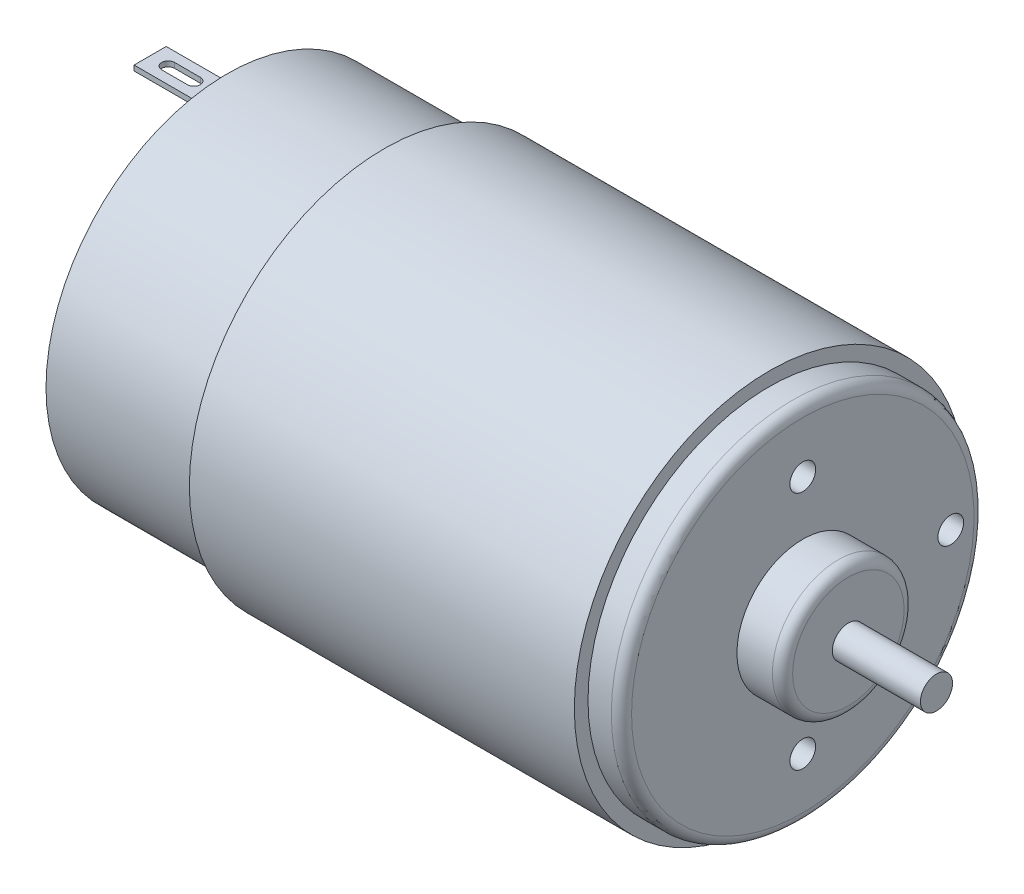
ISO-10303-21;
HEADER;
FILE_DESCRIPTION(('STEP AP214'),'2;1');
FILE_NAME('part.step','',(''),(''),'','','');
FILE_SCHEMA(('AUTOMOTIVE_DESIGN { 1 0 10303 214 1 1 1 1 }'));
ENDSEC;
DATA;
#1=APPLICATION_CONTEXT('core data for automotive mechanical design processes');
#2=APPLICATION_PROTOCOL_DEFINITION('international standard','automotive_design',2000,#1);
#3=PRODUCT_CONTEXT('',#1,'mechanical');
#4=PRODUCT('Part','Part','',(#3));
#5=PRODUCT_RELATED_PRODUCT_CATEGORY('part','',(#4));
#6=PRODUCT_DEFINITION_FORMATION('','',#4);
#7=PRODUCT_DEFINITION_CONTEXT('part definition',#1,'design');
#8=PRODUCT_DEFINITION('design','',#6,#7);
#9=PRODUCT_DEFINITION_SHAPE('','',#8);
#10=(LENGTH_UNIT() NAMED_UNIT(*) SI_UNIT(.MILLI.,.METRE.));
#11=(NAMED_UNIT(*) PLANE_ANGLE_UNIT() SI_UNIT($,.RADIAN.));
#12=(NAMED_UNIT(*) SI_UNIT($,.STERADIAN.) SOLID_ANGLE_UNIT());
#13=UNCERTAINTY_MEASURE_WITH_UNIT(LENGTH_MEASURE(1.E-05),#10,'distance_accuracy_value','');
#14=(GEOMETRIC_REPRESENTATION_CONTEXT(3) GLOBAL_UNCERTAINTY_ASSIGNED_CONTEXT((#13)) GLOBAL_UNIT_ASSIGNED_CONTEXT((#10,
#11,#12)) REPRESENTATION_CONTEXT('',''));
#15=CARTESIAN_POINT('',(0.,0.,0.));
#16=DIRECTION('',(0.,0.,1.));
#17=DIRECTION('',(1.,0.,0.));
#18=AXIS2_PLACEMENT_3D('',#15,#16,#17);
#19=CARTESIAN_POINT('',(-2.62,-15.11,1.5875));
#20=DIRECTION('',(0.,-1.,0.));
#21=DIRECTION('',(0.,0.,1.));
#22=AXIS2_PLACEMENT_3D('',#19,#20,#21);
#23=PLANE('',#22);
#24=DIRECTION('',(0.,0.,1.));
#25=VECTOR('',#24,1.);
#26=CARTESIAN_POINT('',(-2.62,-15.11,-1.5875));
#27=LINE('',#26,#25);
#28=CARTESIAN_POINT('',(-2.62,-15.11,-1.5875));
#29=VERTEX_POINT('',#28);
#30=CARTESIAN_POINT('',(-2.62,-15.11,1.5875));
#31=VERTEX_POINT('',#30);
#32=EDGE_CURVE('E209',#29,#31,#27,.T.);
#33=ORIENTED_EDGE('',*,*,#32,.T.);
#34=DIRECTION('',(1.,0.,0.));
#35=VECTOR('',#34,1.);
#36=CARTESIAN_POINT('',(-2.62,-15.11,1.5875));
#37=LINE('',#36,#35);
#38=CARTESIAN_POINT('',(5.,-15.11,1.5875));
#39=VERTEX_POINT('',#38);
#40=EDGE_CURVE('E217',#31,#39,#37,.T.);
#41=ORIENTED_EDGE('',*,*,#40,.T.);
#42=DIRECTION('',(0.,0.,-1.));
#43=VECTOR('',#42,1.);
#44=CARTESIAN_POINT('',(5.,-15.11,1.5875));
#45=LINE('',#44,#43);
#46=CARTESIAN_POINT('',(5.,-15.11,-1.5875));
#47=VERTEX_POINT('',#46);
#48=EDGE_CURVE('E215',#39,#47,#45,.T.);
#49=ORIENTED_EDGE('',*,*,#48,.T.);
#50=DIRECTION('',(-1.,0.,0.));
#51=VECTOR('',#50,1.);
#52=CARTESIAN_POINT('',(5.,-15.11,-1.5875));
#53=LINE('',#52,#51);
#54=EDGE_CURVE('E212',#47,#29,#53,.T.);
#55=ORIENTED_EDGE('',*,*,#54,.T.);
#56=EDGE_LOOP('',(#33,#41,#49,#55));
#57=FACE_BOUND('',#56,.T.);
#58=DIRECTION('',(1.,0.,0.));
#59=VECTOR('',#58,1.);
#60=CARTESIAN_POINT('',(-0.840000000000002,-15.11,-0.635));
#61=LINE('',#60,#59);
#62=CARTESIAN_POINT('',(-0.840000000000002,-15.11,-0.635));
#63=VERTEX_POINT('',#62);
#64=CARTESIAN_POINT('',(1.7,-15.11,-0.635));
#65=VERTEX_POINT('',#64);
#66=EDGE_CURVE('E192',#63,#65,#61,.T.);
#67=ORIENTED_EDGE('',*,*,#66,.T.);
#68=CARTESIAN_POINT('',(1.7,-15.11,0.));
#69=DIRECTION('',(0.,-1.,0.));
#70=DIRECTION('',(0.,0.,-1.));
#71=AXIS2_PLACEMENT_3D('',#68,#69,#70);
#72=CIRCLE('',#71,0.635);
#73=CARTESIAN_POINT('',(1.7,-15.11,0.635));
#74=VERTEX_POINT('',#73);
#75=EDGE_CURVE('E182',#65,#74,#72,.T.);
#76=ORIENTED_EDGE('',*,*,#75,.T.);
#77=DIRECTION('',(-1.,0.,0.));
#78=VECTOR('',#77,1.);
#79=CARTESIAN_POINT('',(1.7,-15.11,0.635));
#80=LINE('',#79,#78);
#81=CARTESIAN_POINT('',(-0.840000000000002,-15.11,0.635));
#82=VERTEX_POINT('',#81);
#83=EDGE_CURVE('E172',#74,#82,#80,.T.);
#84=ORIENTED_EDGE('',*,*,#83,.T.);
#85=CARTESIAN_POINT('',(-0.840000000000002,-15.11,0.));
#86=DIRECTION('',(0.,-1.,0.));
#87=DIRECTION('',(0.,0.,-1.));
#88=AXIS2_PLACEMENT_3D('',#85,#86,#87);
#89=CIRCLE('',#88,0.635);
#90=EDGE_CURVE('E181',#82,#63,#89,.T.);
#91=ORIENTED_EDGE('',*,*,#90,.T.);
#92=EDGE_LOOP('',(#67,#76,#84,#91));
#93=FACE_BOUND('',#92,.T.);
#94=ADVANCED_FACE('F36',(#57,#93),#23,.F.);
#95=CARTESIAN_POINT('',(-2.62,-15.62,1.5875));
#96=DIRECTION('',(0.,-1.,0.));
#97=DIRECTION('',(0.,0.,1.));
#98=AXIS2_PLACEMENT_3D('',#95,#96,#97);
#99=PLANE('',#98);
#100=DIRECTION('',(0.,0.,1.));
#101=VECTOR('',#100,1.);
#102=CARTESIAN_POINT('',(-2.62,-15.62,-1.5875));
#103=LINE('',#102,#101);
#104=CARTESIAN_POINT('',(-2.62,-15.62,-1.5875));
#105=VERTEX_POINT('',#104);
#106=CARTESIAN_POINT('',(-2.62,-15.62,1.5875));
#107=VERTEX_POINT('',#106);
#108=EDGE_CURVE('E208',#105,#107,#103,.T.);
#109=ORIENTED_EDGE('',*,*,#108,.F.);
#110=DIRECTION('',(-1.,0.,0.));
#111=VECTOR('',#110,1.);
#112=CARTESIAN_POINT('',(5.,-15.62,-1.5875));
#113=LINE('',#112,#111);
#114=CARTESIAN_POINT('',(5.,-15.62,-1.5875));
#115=VERTEX_POINT('',#114);
#116=EDGE_CURVE('E222',#115,#105,#113,.T.);
#117=ORIENTED_EDGE('',*,*,#116,.F.);
#118=DIRECTION('',(0.,0.,-1.));
#119=VECTOR('',#118,1.);
#120=CARTESIAN_POINT('',(5.,-15.62,1.5875));
#121=LINE('',#120,#119);
#122=CARTESIAN_POINT('',(5.,-15.62,1.5875));
#123=VERTEX_POINT('',#122);
#124=EDGE_CURVE('E224',#123,#115,#121,.T.);
#125=ORIENTED_EDGE('',*,*,#124,.F.);
#126=DIRECTION('',(1.,0.,0.));
#127=VECTOR('',#126,1.);
#128=CARTESIAN_POINT('',(-2.62,-15.62,1.5875));
#129=LINE('',#128,#127);
#130=EDGE_CURVE('E213',#107,#123,#129,.T.);
#131=ORIENTED_EDGE('',*,*,#130,.F.);
#132=EDGE_LOOP('',(#109,#117,#125,#131));
#133=FACE_BOUND('',#132,.T.);
#134=CARTESIAN_POINT('',(1.7,-15.62,0.));
#135=DIRECTION('',(0.,1.,0.));
#136=DIRECTION('',(0.,0.,1.));
#137=AXIS2_PLACEMENT_3D('',#134,#135,#136);
#138=CIRCLE('',#137,0.635);
#139=CARTESIAN_POINT('',(1.7,-15.62,0.635));
#140=VERTEX_POINT('',#139);
#141=CARTESIAN_POINT('',(1.7,-15.62,-0.635));
#142=VERTEX_POINT('',#141);
#143=EDGE_CURVE('E188',#140,#142,#138,.T.);
#144=ORIENTED_EDGE('',*,*,#143,.T.);
#145=DIRECTION('',(-1.,0.,0.));
#146=VECTOR('',#145,1.);
#147=CARTESIAN_POINT('',(-0.840000000000002,-15.62,-0.635));
#148=LINE('',#147,#146);
#149=CARTESIAN_POINT('',(-0.840000000000002,-15.62,-0.635));
#150=VERTEX_POINT('',#149);
#151=EDGE_CURVE('E199',#142,#150,#148,.T.);
#152=ORIENTED_EDGE('',*,*,#151,.T.);
#153=CARTESIAN_POINT('',(-0.840000000000002,-15.62,0.));
#154=DIRECTION('',(0.,1.,0.));
#155=DIRECTION('',(0.,0.,1.));
#156=AXIS2_PLACEMENT_3D('',#153,#154,#155);
#157=CIRCLE('',#156,0.635);
#158=CARTESIAN_POINT('',(-0.840000000000002,-15.62,0.635));
#159=VERTEX_POINT('',#158);
#160=EDGE_CURVE('E196',#150,#159,#157,.T.);
#161=ORIENTED_EDGE('',*,*,#160,.T.);
#162=DIRECTION('',(1.,0.,0.));
#163=VECTOR('',#162,1.);
#164=CARTESIAN_POINT('',(1.7,-15.62,0.635));
#165=LINE('',#164,#163);
#166=EDGE_CURVE('E59',#159,#140,#165,.T.);
#167=ORIENTED_EDGE('',*,*,#166,.T.);
#168=EDGE_LOOP('',(#144,#152,#161,#167));
#169=FACE_BOUND('',#168,.T.);
#170=ADVANCED_FACE('F397',(#133,#169),#99,.T.);
#171=CARTESIAN_POINT('',(5.,17.900000014,0.));
#172=DIRECTION('',(1.,0.,0.));
#173=DIRECTION('',(0.,0.,-1.));
#174=AXIS2_PLACEMENT_3D('',#171,#172,#173);
#175=PLANE('',#174);
#176=DIRECTION('',(0.,0.,-1.));
#177=VECTOR('',#176,1.);
#178=CARTESIAN_POINT('',(5.,15.11,1.5875));
#179=LINE('',#178,#177);
#180=CARTESIAN_POINT('',(5.,15.11,1.5875));
#181=VERTEX_POINT('',#180);
#182=CARTESIAN_POINT('',(5.,15.11,-1.5875));
#183=VERTEX_POINT('',#182);
#184=EDGE_CURVE('E278',#181,#183,#179,.T.);
#185=ORIENTED_EDGE('',*,*,#184,.T.);
#186=DIRECTION('',(0.,1.,0.));
#187=VECTOR('',#186,1.);
#188=CARTESIAN_POINT('',(5.,15.11,-1.5875));
#189=LINE('',#188,#187);
#190=CARTESIAN_POINT('',(5.,15.62,-1.5875));
#191=VERTEX_POINT('',#190);
#192=EDGE_CURVE('E296',#183,#191,#189,.T.);
#193=ORIENTED_EDGE('',*,*,#192,.T.);
#194=DIRECTION('',(0.,0.,-1.));
#195=VECTOR('',#194,1.);
#196=CARTESIAN_POINT('',(5.,15.62,1.5875));
#197=LINE('',#196,#195);
#198=CARTESIAN_POINT('',(5.,15.62,1.5875));
#199=VERTEX_POINT('',#198);
#200=EDGE_CURVE('E289',#199,#191,#197,.T.);
#201=ORIENTED_EDGE('',*,*,#200,.F.);
#202=DIRECTION('',(0.,1.,0.));
#203=VECTOR('',#202,1.);
#204=CARTESIAN_POINT('',(5.,15.11,1.5875));
#205=LINE('',#204,#203);
#206=EDGE_CURVE('E299',#181,#199,#205,.T.);
#207=ORIENTED_EDGE('',*,*,#206,.F.);
#208=EDGE_LOOP('',(#185,#193,#201,#207));
#209=FACE_BOUND('',#208,.T.);
#210=CARTESIAN_POINT('',(5.,0.,0.));
#211=DIRECTION('',(-1.,0.,0.));
#212=DIRECTION('',(0.,0.,1.));
#213=AXIS2_PLACEMENT_3D('',#210,#211,#212);
#214=CIRCLE('',#213,5.1);
#215=CARTESIAN_POINT('',(5.,0.,5.1));
#216=VERTEX_POINT('',#215);
#217=EDGE_CURVE('E343',#216,#216,#214,.T.);
#218=ORIENTED_EDGE('',*,*,#217,.F.);
#219=EDGE_LOOP('',(#218));
#220=FACE_BOUND('',#219,.T.);
#221=CARTESIAN_POINT('',(5.,0.,0.));
#222=DIRECTION('',(-1.,0.,0.));
#223=DIRECTION('',(0.,0.,1.));
#224=AXIS2_PLACEMENT_3D('',#221,#222,#223);
#225=CIRCLE('',#224,17.900000014);
#226=CARTESIAN_POINT('',(5.,0.,17.900000014));
#227=VERTEX_POINT('',#226);
#228=EDGE_CURVE('E346',#227,#227,#225,.T.);
#229=ORIENTED_EDGE('',*,*,#228,.T.);
#230=EDGE_LOOP('',(#229));
#231=FACE_BOUND('',#230,.T.);
#232=ORIENTED_EDGE('',*,*,#48,.F.);
#233=DIRECTION('',(0.,-1.,0.));
#234=VECTOR('',#233,1.);
#235=CARTESIAN_POINT('',(5.,-15.11,1.5875));
#236=LINE('',#235,#234);
#237=EDGE_CURVE('E232',#39,#123,#236,.T.);
#238=ORIENTED_EDGE('',*,*,#237,.T.);
#239=ORIENTED_EDGE('',*,*,#124,.T.);
#240=DIRECTION('',(0.,-1.,0.));
#241=VECTOR('',#240,1.);
#242=CARTESIAN_POINT('',(5.,-15.11,-1.5875));
#243=LINE('',#242,#241);
#244=EDGE_CURVE('E235',#47,#115,#243,.T.);
#245=ORIENTED_EDGE('',*,*,#244,.F.);
#246=EDGE_LOOP('',(#232,#238,#239,#245));
#247=FACE_BOUND('',#246,.T.);
#248=ADVANCED_FACE('F403',(#209,#220,#231,#247),#175,.F.);
#249=CARTESIAN_POINT('',(0.,1.58499999999999,0.));
#250=DIRECTION('',(1.,0.,0.));
#251=DIRECTION('',(0.,0.,-1.));
#252=AXIS2_PLACEMENT_3D('',#249,#250,#251);
#253=PLANE('',#252);
#254=CARTESIAN_POINT('',(0.,0.,0.));
#255=DIRECTION('',(-1.,0.,0.));
#256=DIRECTION('',(0.,0.,1.));
#257=AXIS2_PLACEMENT_3D('',#254,#255,#256);
#258=CIRCLE('',#257,1.58499999999999);
#259=CARTESIAN_POINT('',(0.,0.,1.58499999999999));
#260=VERTEX_POINT('',#259);
#261=EDGE_CURVE('E335',#260,#260,#258,.T.);
#262=ORIENTED_EDGE('',*,*,#261,.T.);
#263=EDGE_LOOP('',(#262));
#264=FACE_BOUND('',#263,.T.);
#265=ADVANCED_FACE('F504',(#264),#253,.F.);
#266=CARTESIAN_POINT('',(75.,0.,0.));
#267=DIRECTION('',(-1.,0.,0.));
#268=DIRECTION('',(0.,0.,1.));
#269=AXIS2_PLACEMENT_3D('',#266,#267,#268);
#270=PLANE('',#269);
#271=CARTESIAN_POINT('',(75.,0.,0.));
#272=DIRECTION('',(-1.,0.,0.));
#273=DIRECTION('',(0.,0.,1.));
#274=AXIS2_PLACEMENT_3D('',#271,#272,#273);
#275=CIRCLE('',#274,1.585);
#276=CARTESIAN_POINT('',(75.,0.,1.585));
#277=VERTEX_POINT('',#276);
#278=EDGE_CURVE('E367',#277,#277,#275,.T.);
#279=ORIENTED_EDGE('',*,*,#278,.F.);
#280=EDGE_LOOP('',(#279));
#281=FACE_BOUND('',#280,.T.);
#282=ADVANCED_FACE('F536',(#281),#270,.F.);
#283=CARTESIAN_POINT('',(0.,0.,0.));
#284=DIRECTION('',(-1.,0.,0.));
#285=DIRECTION('',(0.,0.,1.));
#286=AXIS2_PLACEMENT_3D('',#283,#284,#285);
#287=CYLINDRICAL_SURFACE('',#286,1.585);
#288=CARTESIAN_POINT('',(66.3,0.,0.));
#289=DIRECTION('',(-1.,0.,0.));
#290=DIRECTION('',(0.,0.,1.));
#291=AXIS2_PLACEMENT_3D('',#288,#289,#290);
#292=CIRCLE('',#291,1.585);
#293=CARTESIAN_POINT('',(66.3,0.,1.585));
#294=VERTEX_POINT('',#293);
#295=EDGE_CURVE('E364',#294,#294,#292,.T.);
#296=ORIENTED_EDGE('',*,*,#295,.F.);
#297=EDGE_LOOP('',(#296));
#298=FACE_BOUND('',#297,.T.);
#299=ORIENTED_EDGE('',*,*,#278,.T.);
#300=EDGE_LOOP('',(#299));
#301=FACE_BOUND('',#300,.T.);
#302=ADVANCED_FACE('F532',(#298,#301),#287,.T.);
#303=CARTESIAN_POINT('',(66.3,1.585,0.));
#304=DIRECTION('',(-1.,0.,0.));
#305=DIRECTION('',(0.,0.,1.));
#306=AXIS2_PLACEMENT_3D('',#303,#304,#305);
#307=PLANE('',#306);
#308=CARTESIAN_POINT('',(66.3,0.,0.));
#309=DIRECTION('',(-1.,0.,0.));
#310=DIRECTION('',(0.,0.,1.));
#311=AXIS2_PLACEMENT_3D('',#308,#309,#310);
#312=CIRCLE('',#311,5.5);
#313=CARTESIAN_POINT('',(66.3,0.,5.5));
#314=VERTEX_POINT('',#313);
#315=EDGE_CURVE('E373',#314,#314,#312,.F.);
#316=ORIENTED_EDGE('',*,*,#315,.T.);
#317=EDGE_LOOP('',(#316));
#318=FACE_BOUND('',#317,.T.);
#319=ORIENTED_EDGE('',*,*,#295,.T.);
#320=EDGE_LOOP('',(#319));
#321=FACE_BOUND('',#320,.T.);
#322=ADVANCED_FACE('F528',(#318,#321),#307,.F.);
#323=CARTESIAN_POINT('',(0.,0.,0.));
#324=DIRECTION('',(-1.,0.,0.));
#325=DIRECTION('',(0.,0.,1.));
#326=AXIS2_PLACEMENT_3D('',#323,#324,#325);
#327=CYLINDRICAL_SURFACE('',#326,6.5);
#328=CARTESIAN_POINT('',(65.3,0.,0.));
#329=DIRECTION('',(-1.,0.,0.));
#330=DIRECTION('',(0.,0.,1.));
#331=AXIS2_PLACEMENT_3D('',#328,#329,#330);
#332=CIRCLE('',#331,6.5);
#333=CARTESIAN_POINT('',(65.3,0.,6.5));
#334=VERTEX_POINT('',#333);
#335=EDGE_CURVE('E370',#334,#334,#332,.T.);
#336=ORIENTED_EDGE('',*,*,#335,.T.);
#337=EDGE_LOOP('',(#336));
#338=FACE_BOUND('',#337,.T.);
#339=CARTESIAN_POINT('',(61.8,0.,0.));
#340=DIRECTION('',(-1.,0.,0.));
#341=DIRECTION('',(0.,0.,1.));
#342=AXIS2_PLACEMENT_3D('',#339,#340,#341);
#343=CIRCLE('',#342,6.5);
#344=CARTESIAN_POINT('',(61.8,0.,6.5));
#345=VERTEX_POINT('',#344);
#346=EDGE_CURVE('E361',#345,#345,#343,.T.);
#347=ORIENTED_EDGE('',*,*,#346,.F.);
#348=EDGE_LOOP('',(#347));
#349=FACE_BOUND('',#348,.T.);
#350=ADVANCED_FACE('F524',(#338,#349),#327,.T.);
#351=CARTESIAN_POINT('',(61.8,6.5,0.));
#352=DIRECTION('',(-1.,0.,0.));
#353=DIRECTION('',(0.,0.,1.));
#354=AXIS2_PLACEMENT_3D('',#351,#352,#353);
#355=PLANE('',#354);
#356=CARTESIAN_POINT('',(61.8,0.,0.));
#357=DIRECTION('',(-1.,0.,0.));
#358=DIRECTION('',(0.,0.,1.));
#359=AXIS2_PLACEMENT_3D('',#356,#357,#358);
#360=CIRCLE('',#359,16.900000014);
#361=CARTESIAN_POINT('',(61.8,0.,16.900000014));
#362=VERTEX_POINT('',#361);
#363=EDGE_CURVE('E379',#362,#362,#360,.F.);
#364=ORIENTED_EDGE('',*,*,#363,.T.);
#365=EDGE_LOOP('',(#364));
#366=FACE_BOUND('',#365,.T.);
#367=CARTESIAN_POINT('',(61.8,0.,-14.605));
#368=DIRECTION('',(1.,0.,0.));
#369=DIRECTION('',(0.,0.,-1.));
#370=AXIS2_PLACEMENT_3D('',#367,#368,#369);
#371=CIRCLE('',#370,1.27);
#372=CARTESIAN_POINT('',(61.8,0.,-15.875));
#373=VERTEX_POINT('',#372);
#374=EDGE_CURVE('E319',#373,#373,#371,.T.);
#375=ORIENTED_EDGE('',*,*,#374,.F.);
#376=EDGE_LOOP('',(#375));
#377=FACE_BOUND('',#376,.T.);
#378=CARTESIAN_POINT('',(61.8,-11.84,0.));
#379=DIRECTION('',(1.,0.,0.));
#380=DIRECTION('',(0.,0.,1.));
#381=AXIS2_PLACEMENT_3D('',#378,#379,#380);
#382=CIRCLE('',#381,1.27);
#383=CARTESIAN_POINT('',(61.8,-11.84,1.27000000000008));
#384=VERTEX_POINT('',#383);
#385=EDGE_CURVE('E325',#384,#384,#382,.T.);
#386=ORIENTED_EDGE('',*,*,#385,.F.);
#387=EDGE_LOOP('',(#386));
#388=FACE_BOUND('',#387,.T.);
#389=CARTESIAN_POINT('',(61.8,11.84,0.));
#390=DIRECTION('',(1.,0.,0.));
#391=DIRECTION('',(0.,0.,-1.));
#392=AXIS2_PLACEMENT_3D('',#389,#390,#391);
#393=CIRCLE('',#392,1.27);
#394=CARTESIAN_POINT('',(61.8,11.84,-1.27));
#395=VERTEX_POINT('',#394);
#396=EDGE_CURVE('E329',#395,#395,#393,.T.);
#397=ORIENTED_EDGE('',*,*,#396,.F.);
#398=EDGE_LOOP('',(#397));
#399=FACE_BOUND('',#398,.T.);
#400=ORIENTED_EDGE('',*,*,#346,.T.);
#401=EDGE_LOOP('',(#400));
#402=FACE_BOUND('',#401,.T.);
#403=ADVANCED_FACE('F520',(#366,#377,#388,#399,#402),#355,.F.);
#404=CARTESIAN_POINT('',(58.5,17.900000014,0.));
#405=DIRECTION('',(-1.,0.,0.));
#406=DIRECTION('',(0.,0.,1.));
#407=AXIS2_PLACEMENT_3D('',#404,#405,#406);
#408=PLANE('',#407);
#409=CARTESIAN_POINT('',(58.5,0.,0.));
#410=DIRECTION('',(-1.,0.,0.));
#411=DIRECTION('',(0.,0.,1.));
#412=AXIS2_PLACEMENT_3D('',#409,#410,#411);
#413=CIRCLE('',#412,17.900000014);
#414=CARTESIAN_POINT('',(58.5,-1.145,-17.8633416666983));
#415=VERTEX_POINT('',#414);
#416=CARTESIAN_POINT('',(58.5,1.145,-17.8633416666983));
#417=VERTEX_POINT('',#416);
#418=EDGE_CURVE('E358',#415,#417,#413,.T.);
#419=ORIENTED_EDGE('',*,*,#418,.T.);
#420=DIRECTION('',(0.,0.,1.));
#421=VECTOR('',#420,1.);
#422=CARTESIAN_POINT('',(58.5,1.145,-17.8633416666983));
#423=LINE('',#422,#421);
#424=CARTESIAN_POINT('',(58.5,1.145,-19.215917211221));
#425=VERTEX_POINT('',#424);
#426=EDGE_CURVE('E310',#425,#417,#423,.T.);
#427=ORIENTED_EDGE('',*,*,#426,.F.);
#428=CARTESIAN_POINT('',(58.5,0.,0.));
#429=DIRECTION('',(-1.,0.,0.));
#430=DIRECTION('',(0.,0.,1.));
#431=AXIS2_PLACEMENT_3D('',#428,#429,#430);
#432=CIRCLE('',#431,19.249999981);
#433=CARTESIAN_POINT('',(58.5,-1.145,-19.215917211221));
#434=VERTEX_POINT('',#433);
#435=EDGE_CURVE('E355',#434,#425,#432,.T.);
#436=ORIENTED_EDGE('',*,*,#435,.F.);
#437=DIRECTION('',(0.,0.,-1.));
#438=VECTOR('',#437,1.);
#439=CARTESIAN_POINT('',(58.5,-1.145,-17.8633416666983));
#440=LINE('',#439,#438);
#441=EDGE_CURVE('E308',#415,#434,#440,.T.);
#442=ORIENTED_EDGE('',*,*,#441,.F.);
#443=EDGE_LOOP('',(#419,#427,#436,#442));
#444=FACE_BOUND('',#443,.T.);
#445=ADVANCED_FACE('F516',(#444),#408,.F.);
#446=CARTESIAN_POINT('',(0.,0.,0.));
#447=DIRECTION('',(-1.,0.,0.));
#448=DIRECTION('',(0.,0.,1.));
#449=AXIS2_PLACEMENT_3D('',#446,#447,#448);
#450=CYLINDRICAL_SURFACE('',#449,19.249999981);
#451=ORIENTED_EDGE('',*,*,#435,.T.);
#452=DIRECTION('',(-1.,0.,0.));
#453=VECTOR('',#452,1.);
#454=CARTESIAN_POINT('',(0.,1.145,-19.215917211221));
#455=LINE('',#454,#453);
#456=CARTESIAN_POINT('',(20.5,1.145,-19.215917211221));
#457=VERTEX_POINT('',#456);
#458=EDGE_CURVE('E304',#457,#425,#455,.F.);
#459=ORIENTED_EDGE('',*,*,#458,.F.);
#460=CARTESIAN_POINT('',(20.5,0.,0.));
#461=DIRECTION('',(-1.,0.,0.));
#462=DIRECTION('',(0.,0.,1.));
#463=AXIS2_PLACEMENT_3D('',#460,#461,#462);
#464=CIRCLE('',#463,19.249999981);
#465=CARTESIAN_POINT('',(20.5,-1.145,-19.215917211221));
#466=VERTEX_POINT('',#465);
#467=EDGE_CURVE('E352',#466,#457,#464,.T.);
#468=ORIENTED_EDGE('',*,*,#467,.F.);
#469=DIRECTION('',(-1.,0.,0.));
#470=VECTOR('',#469,1.);
#471=CARTESIAN_POINT('',(0.,-1.145,-19.215917211221));
#472=LINE('',#471,#470);
#473=EDGE_CURVE('E295',#434,#466,#472,.T.);
#474=ORIENTED_EDGE('',*,*,#473,.F.);
#475=EDGE_LOOP('',(#451,#459,#468,#474));
#476=FACE_BOUND('',#475,.T.);
#477=ADVANCED_FACE('F512',(#476),#450,.T.);
#478=CARTESIAN_POINT('',(20.5,19.249999981,0.));
#479=DIRECTION('',(1.,0.,0.));
#480=DIRECTION('',(0.,0.,-1.));
#481=AXIS2_PLACEMENT_3D('',#478,#479,#480);
#482=PLANE('',#481);
#483=ORIENTED_EDGE('',*,*,#467,.T.);
#484=DIRECTION('',(0.,0.,-1.));
#485=VECTOR('',#484,1.);
#486=CARTESIAN_POINT('',(20.5,1.145,-17.8633416666983));
#487=LINE('',#486,#485);
#488=CARTESIAN_POINT('',(20.5000000000001,1.145,-17.8633416666983));
#489=VERTEX_POINT('',#488);
#490=EDGE_CURVE('E306',#489,#457,#487,.T.);
#491=ORIENTED_EDGE('',*,*,#490,.F.);
#492=CARTESIAN_POINT('',(20.5000000000001,0.,0.));
#493=DIRECTION('',(-1.,0.,0.));
#494=DIRECTION('',(0.,0.,1.));
#495=AXIS2_PLACEMENT_3D('',#492,#493,#494);
#496=CIRCLE('',#495,17.900000014);
#497=CARTESIAN_POINT('',(20.5000000000001,-1.145,-17.8633416666983));
#498=VERTEX_POINT('',#497);
#499=EDGE_CURVE('E349',#498,#489,#496,.T.);
#500=ORIENTED_EDGE('',*,*,#499,.F.);
#501=DIRECTION('',(0.,0.,1.));
#502=VECTOR('',#501,1.);
#503=CARTESIAN_POINT('',(20.5,-1.145,-17.8633416666983));
#504=LINE('',#503,#502);
#505=EDGE_CURVE('E316',#466,#498,#504,.T.);
#506=ORIENTED_EDGE('',*,*,#505,.F.);
#507=EDGE_LOOP('',(#483,#491,#500,#506));
#508=FACE_BOUND('',#507,.T.);
#509=ADVANCED_FACE('F508',(#508),#482,.F.);
#510=CARTESIAN_POINT('',(0.,0.,0.));
#511=DIRECTION('',(-1.,0.,0.));
#512=DIRECTION('',(0.,0.,1.));
#513=AXIS2_PLACEMENT_3D('',#510,#511,#512);
#514=CYLINDRICAL_SURFACE('',#513,17.900000014);
#515=CARTESIAN_POINT('',(60.8,0.,0.));
#516=DIRECTION('',(-1.,0.,0.));
#517=DIRECTION('',(0.,0.,1.));
#518=AXIS2_PLACEMENT_3D('',#515,#516,#517);
#519=CIRCLE('',#518,17.900000014);
#520=CARTESIAN_POINT('',(60.8,0.,17.900000014));
#521=VERTEX_POINT('',#520);
#522=EDGE_CURVE('E376',#521,#521,#519,.T.);
#523=ORIENTED_EDGE('',*,*,#522,.T.);
#524=EDGE_LOOP('',(#523));
#525=FACE_BOUND('',#524,.T.);
#526=ORIENTED_EDGE('',*,*,#228,.F.);
#527=EDGE_LOOP('',(#526));
#528=FACE_BOUND('',#527,.T.);
#529=ORIENTED_EDGE('',*,*,#499,.T.);
#530=DIRECTION('',(1.,0.,0.));
#531=VECTOR('',#530,1.);
#532=CARTESIAN_POINT('',(-0.001000000000001,1.145,-17.8633416666983));
#533=LINE('',#532,#531);
#534=EDGE_CURVE('E314',#489,#417,#533,.T.);
#535=ORIENTED_EDGE('',*,*,#534,.T.);
#536=ORIENTED_EDGE('',*,*,#418,.F.);
#537=DIRECTION('',(1.,0.,0.));
#538=VECTOR('',#537,1.);
#539=CARTESIAN_POINT('',(-0.001000000000001,-1.145,-17.8633416666983));
#540=LINE('',#539,#538);
#541=EDGE_CURVE('E313',#498,#415,#540,.T.);
#542=ORIENTED_EDGE('',*,*,#541,.F.);
#543=EDGE_LOOP('',(#529,#535,#536,#542));
#544=FACE_BOUND('',#543,.T.);
#545=ADVANCED_FACE('F500',(#525,#528,#544),#514,.T.);
#546=CARTESIAN_POINT('',(0.,0.,0.));
#547=DIRECTION('',(-1.,0.,0.));
#548=DIRECTION('',(0.,0.,1.));
#549=AXIS2_PLACEMENT_3D('',#546,#547,#548);
#550=CYLINDRICAL_SURFACE('',#549,5.1);
#551=CARTESIAN_POINT('',(3.,0.,0.));
#552=DIRECTION('',(1.,0.,0.));
#553=DIRECTION('',(0.,0.,-1.));
#554=AXIS2_PLACEMENT_3D('',#551,#552,#553);
#555=CIRCLE('',#554,5.1);
#556=CARTESIAN_POINT('',(3.,0.,-5.1));
#557=VERTEX_POINT('',#556);
#558=EDGE_CURVE('E11',#557,#557,#555,.T.);
#559=ORIENTED_EDGE('',*,*,#558,.T.);
#560=EDGE_LOOP('',(#559));
#561=FACE_BOUND('',#560,.T.);
#562=ORIENTED_EDGE('',*,*,#217,.T.);
#563=EDGE_LOOP('',(#562));
#564=FACE_BOUND('',#563,.T.);
#565=ADVANCED_FACE('F497',(#561,#564),#550,.T.);
#566=CARTESIAN_POINT('',(2.,5.1,0.));
#567=DIRECTION('',(1.,0.,0.));
#568=DIRECTION('',(0.,0.,-1.));
#569=AXIS2_PLACEMENT_3D('',#566,#567,#568);
#570=PLANE('',#569);
#571=CARTESIAN_POINT('',(2.,0.,0.));
#572=DIRECTION('',(1.,0.,0.));
#573=DIRECTION('',(0.,0.,-1.));
#574=AXIS2_PLACEMENT_3D('',#571,#572,#573);
#575=CIRCLE('',#574,4.1);
#576=CARTESIAN_POINT('',(2.,0.,-4.1));
#577=VERTEX_POINT('',#576);
#578=EDGE_CURVE('E44',#577,#577,#575,.F.);
#579=ORIENTED_EDGE('',*,*,#578,.T.);
#580=EDGE_LOOP('',(#579));
#581=FACE_BOUND('',#580,.T.);
#582=CARTESIAN_POINT('',(2.,0.,0.));
#583=DIRECTION('',(-1.,0.,0.));
#584=DIRECTION('',(0.,0.,1.));
#585=AXIS2_PLACEMENT_3D('',#582,#583,#584);
#586=CIRCLE('',#585,1.58499999999999);
#587=CARTESIAN_POINT('',(2.,0.,1.58499999999999));
#588=VERTEX_POINT('',#587);
#589=EDGE_CURVE('E340',#588,#588,#586,.T.);
#590=ORIENTED_EDGE('',*,*,#589,.F.);
#591=EDGE_LOOP('',(#590));
#592=FACE_BOUND('',#591,.T.);
#593=ADVANCED_FACE('F384',(#581,#592),#570,.F.);
#594=CARTESIAN_POINT('',(0.,0.,0.));
#595=DIRECTION('',(-1.,0.,0.));
#596=DIRECTION('',(0.,0.,1.));
#597=AXIS2_PLACEMENT_3D('',#594,#595,#596);
#598=CYLINDRICAL_SURFACE('',#597,1.58499999999999);
#599=ORIENTED_EDGE('',*,*,#261,.F.);
#600=EDGE_LOOP('',(#599));
#601=FACE_BOUND('',#600,.T.);
#602=ORIENTED_EDGE('',*,*,#589,.T.);
#603=EDGE_LOOP('',(#602));
#604=FACE_BOUND('',#603,.T.);
#605=ADVANCED_FACE('F490',(#601,#604),#598,.T.);
#606=CARTESIAN_POINT('',(56.72,11.84,0.));
#607=DIRECTION('',(1.,0.,0.));
#608=DIRECTION('',(0.,0.,-1.));
#609=AXIS2_PLACEMENT_3D('',#606,#607,#608);
#610=CYLINDRICAL_SURFACE('',#609,1.27);
#611=CARTESIAN_POINT('',(56.72,11.84,0.));
#612=DIRECTION('',(1.,0.,0.));
#613=DIRECTION('',(0.,0.,-1.));
#614=AXIS2_PLACEMENT_3D('',#611,#612,#613);
#615=CIRCLE('',#614,1.27);
#616=CARTESIAN_POINT('',(56.72,11.84,-1.27));
#617=VERTEX_POINT('',#616);
#618=EDGE_CURVE('E332',#617,#617,#615,.T.);
#619=ORIENTED_EDGE('',*,*,#618,.F.);
#620=EDGE_LOOP('',(#619));
#621=FACE_BOUND('',#620,.T.);
#622=ORIENTED_EDGE('',*,*,#396,.T.);
#623=EDGE_LOOP('',(#622));
#624=FACE_BOUND('',#623,.T.);
#625=ADVANCED_FACE('F486',(#621,#624),#610,.F.);
#626=CARTESIAN_POINT('',(56.72,11.84,0.));
#627=DIRECTION('',(1.,0.,0.));
#628=DIRECTION('',(0.,0.,-1.));
#629=AXIS2_PLACEMENT_3D('',#626,#627,#628);
#630=PLANE('',#629);
#631=ORIENTED_EDGE('',*,*,#618,.T.);
#632=EDGE_LOOP('',(#631));
#633=FACE_BOUND('',#632,.T.);
#634=ADVANCED_FACE('F482',(#633),#630,.T.);
#635=CARTESIAN_POINT('',(56.72,-11.84,0.));
#636=DIRECTION('',(1.,0.,0.));
#637=DIRECTION('',(0.,0.,-1.));
#638=AXIS2_PLACEMENT_3D('',#635,#636,#637);
#639=CYLINDRICAL_SURFACE('',#638,1.27);
#640=CARTESIAN_POINT('',(56.72,-11.84,0.));
#641=DIRECTION('',(1.,0.,0.));
#642=DIRECTION('',(0.,0.,1.));
#643=AXIS2_PLACEMENT_3D('',#640,#641,#642);
#644=CIRCLE('',#643,1.27);
#645=CARTESIAN_POINT('',(56.72,-11.84,1.27000000000008));
#646=VERTEX_POINT('',#645);
#647=EDGE_CURVE('E326',#646,#646,#644,.T.);
#648=ORIENTED_EDGE('',*,*,#647,.F.);
#649=EDGE_LOOP('',(#648));
#650=FACE_BOUND('',#649,.T.);
#651=ORIENTED_EDGE('',*,*,#385,.T.);
#652=EDGE_LOOP('',(#651));
#653=FACE_BOUND('',#652,.T.);
#654=ADVANCED_FACE('F478',(#650,#653),#639,.F.);
#655=CARTESIAN_POINT('',(56.72,-11.84,0.));
#656=DIRECTION('',(1.,0.,0.));
#657=DIRECTION('',(0.,0.,1.));
#658=AXIS2_PLACEMENT_3D('',#655,#656,#657);
#659=PLANE('',#658);
#660=ORIENTED_EDGE('',*,*,#647,.T.);
#661=EDGE_LOOP('',(#660));
#662=FACE_BOUND('',#661,.T.);
#663=ADVANCED_FACE('F474',(#662),#659,.T.);
#664=CARTESIAN_POINT('',(53.1278975515723,0.,-14.605));
#665=DIRECTION('',(1.,0.,0.));
#666=DIRECTION('',(0.,0.,-1.));
#667=AXIS2_PLACEMENT_3D('',#664,#665,#666);
#668=CYLINDRICAL_SURFACE('',#667,1.27);
#669=CARTESIAN_POINT('',(56.72,0.,-14.605));
#670=DIRECTION('',(1.,0.,0.));
#671=DIRECTION('',(0.,0.,-1.));
#672=AXIS2_PLACEMENT_3D('',#669,#670,#671);
#673=CIRCLE('',#672,1.27);
#674=CARTESIAN_POINT('',(56.72,0.,-15.875));
#675=VERTEX_POINT('',#674);
#676=EDGE_CURVE('E322',#675,#675,#673,.F.);
#677=ORIENTED_EDGE('',*,*,#676,.T.);
#678=EDGE_LOOP('',(#677));
#679=FACE_BOUND('',#678,.T.);
#680=ORIENTED_EDGE('',*,*,#374,.T.);
#681=EDGE_LOOP('',(#680));
#682=FACE_BOUND('',#681,.T.);
#683=ADVANCED_FACE('F470',(#679,#682),#668,.F.);
#684=CARTESIAN_POINT('',(56.72,11.84,0.));
#685=DIRECTION('',(1.,0.,0.));
#686=DIRECTION('',(0.,0.,-1.));
#687=AXIS2_PLACEMENT_3D('',#684,#685,#686);
#688=PLANE('',#687);
#689=ORIENTED_EDGE('',*,*,#676,.F.);
#690=EDGE_LOOP('',(#689));
#691=FACE_BOUND('',#690,.T.);
#692=ADVANCED_FACE('F463',(#691),#688,.T.);
#693=CARTESIAN_POINT('',(-0.001000000000001,1.145,-17.8633416666983));
#694=DIRECTION('',(0.,1.,0.));
#695=DIRECTION('',(0.,0.,1.));
#696=AXIS2_PLACEMENT_3D('',#693,#694,#695);
#697=PLANE('',#696);
#698=ORIENTED_EDGE('',*,*,#458,.T.);
#699=ORIENTED_EDGE('',*,*,#426,.T.);
#700=ORIENTED_EDGE('',*,*,#534,.F.);
#701=ORIENTED_EDGE('',*,*,#490,.T.);
#702=EDGE_LOOP('',(#698,#699,#700,#701));
#703=FACE_BOUND('',#702,.T.);
#704=ADVANCED_FACE('F460',(#703),#697,.F.);
#705=CARTESIAN_POINT('',(-0.001000000000001,-1.145,-17.8633416666983));
#706=DIRECTION('',(0.,-1.,0.));
#707=DIRECTION('',(0.,0.,-1.));
#708=AXIS2_PLACEMENT_3D('',#705,#706,#707);
#709=PLANE('',#708);
#710=ORIENTED_EDGE('',*,*,#473,.T.);
#711=ORIENTED_EDGE('',*,*,#505,.T.);
#712=ORIENTED_EDGE('',*,*,#541,.T.);
#713=ORIENTED_EDGE('',*,*,#441,.T.);
#714=EDGE_LOOP('',(#710,#711,#712,#713));
#715=FACE_BOUND('',#714,.T.);
#716=ADVANCED_FACE('F458',(#715),#709,.F.);
#717=CARTESIAN_POINT('',(-2.62,15.11,-1.5875));
#718=DIRECTION('',(-1.,0.,0.));
#719=DIRECTION('',(0.,0.,1.));
#720=AXIS2_PLACEMENT_3D('',#717,#718,#719);
#721=PLANE('',#720);
#722=DIRECTION('',(0.,0.,1.));
#723=VECTOR('',#722,1.);
#724=CARTESIAN_POINT('',(-2.62,15.62,-1.5875));
#725=LINE('',#724,#723);
#726=CARTESIAN_POINT('',(-2.62,15.62,-1.5875));
#727=VERTEX_POINT('',#726);
#728=CARTESIAN_POINT('',(-2.62,15.62,1.5875));
#729=VERTEX_POINT('',#728);
#730=EDGE_CURVE('E270',#727,#729,#725,.T.);
#731=ORIENTED_EDGE('',*,*,#730,.F.);
#732=DIRECTION('',(0.,1.,0.));
#733=VECTOR('',#732,1.);
#734=CARTESIAN_POINT('',(-2.62,15.11,-1.5875));
#735=LINE('',#734,#733);
#736=CARTESIAN_POINT('',(-2.62,15.11,-1.5875));
#737=VERTEX_POINT('',#736);
#738=EDGE_CURVE('E293',#737,#727,#735,.T.);
#739=ORIENTED_EDGE('',*,*,#738,.F.);
#740=DIRECTION('',(0.,0.,1.));
#741=VECTOR('',#740,1.);
#742=CARTESIAN_POINT('',(-2.62,15.11,-1.5875));
#743=LINE('',#742,#741);
#744=CARTESIAN_POINT('',(-2.62,15.11,1.5875));
#745=VERTEX_POINT('',#744);
#746=EDGE_CURVE('E271',#737,#745,#743,.T.);
#747=ORIENTED_EDGE('',*,*,#746,.T.);
#748=DIRECTION('',(0.,1.,0.));
#749=VECTOR('',#748,1.);
#750=CARTESIAN_POINT('',(-2.62,15.11,1.5875));
#751=LINE('',#750,#749);
#752=EDGE_CURVE('E284',#745,#729,#751,.T.);
#753=ORIENTED_EDGE('',*,*,#752,.T.);
#754=EDGE_LOOP('',(#731,#739,#747,#753));
#755=FACE_BOUND('',#754,.T.);
#756=ADVANCED_FACE('F451',(#755),#721,.T.);
#757=CARTESIAN_POINT('',(5.,15.11,-1.5875));
#758=DIRECTION('',(0.,0.,-1.));
#759=DIRECTION('',(-1.,0.,0.));
#760=AXIS2_PLACEMENT_3D('',#757,#758,#759);
#761=PLANE('',#760);
#762=DIRECTION('',(-1.,0.,0.));
#763=VECTOR('',#762,1.);
#764=CARTESIAN_POINT('',(5.,15.62,-1.5875));
#765=LINE('',#764,#763);
#766=EDGE_CURVE('E275',#191,#727,#765,.T.);
#767=ORIENTED_EDGE('',*,*,#766,.F.);
#768=ORIENTED_EDGE('',*,*,#192,.F.);
#769=DIRECTION('',(-1.,0.,0.));
#770=VECTOR('',#769,1.);
#771=CARTESIAN_POINT('',(5.,15.11,-1.5875));
#772=LINE('',#771,#770);
#773=EDGE_CURVE('E281',#183,#737,#772,.T.);
#774=ORIENTED_EDGE('',*,*,#773,.T.);
#775=ORIENTED_EDGE('',*,*,#738,.T.);
#776=EDGE_LOOP('',(#767,#768,#774,#775));
#777=FACE_BOUND('',#776,.T.);
#778=ADVANCED_FACE('F448',(#777),#761,.T.);
#779=CARTESIAN_POINT('',(-2.62,15.11,1.5875));
#780=DIRECTION('',(0.,0.,1.));
#781=DIRECTION('',(1.,0.,0.));
#782=AXIS2_PLACEMENT_3D('',#779,#780,#781);
#783=PLANE('',#782);
#784=DIRECTION('',(1.,0.,0.));
#785=VECTOR('',#784,1.);
#786=CARTESIAN_POINT('',(-2.62,15.62,1.5875));
#787=LINE('',#786,#785);
#788=EDGE_CURVE('E287',#729,#199,#787,.T.);
#789=ORIENTED_EDGE('',*,*,#788,.F.);
#790=ORIENTED_EDGE('',*,*,#752,.F.);
#791=DIRECTION('',(1.,0.,0.));
#792=VECTOR('',#791,1.);
#793=CARTESIAN_POINT('',(-2.62,15.11,1.5875));
#794=LINE('',#793,#792);
#795=EDGE_CURVE('E274',#745,#181,#794,.T.);
#796=ORIENTED_EDGE('',*,*,#795,.T.);
#797=ORIENTED_EDGE('',*,*,#206,.T.);
#798=EDGE_LOOP('',(#789,#790,#796,#797));
#799=FACE_BOUND('',#798,.T.);
#800=ADVANCED_FACE('F443',(#799),#783,.T.);
#801=CARTESIAN_POINT('',(-2.62,15.11,1.5875));
#802=DIRECTION('',(0.,1.,0.));
#803=DIRECTION('',(0.,0.,1.));
#804=AXIS2_PLACEMENT_3D('',#801,#802,#803);
#805=PLANE('',#804);
#806=DIRECTION('',(1.,0.,0.));
#807=VECTOR('',#806,1.);
#808=CARTESIAN_POINT('',(-0.840000000000002,15.11,-0.635));
#809=LINE('',#808,#807);
#810=CARTESIAN_POINT('',(-0.840000000000002,15.11,-0.635));
#811=VERTEX_POINT('',#810);
#812=CARTESIAN_POINT('',(1.7,15.11,-0.635));
#813=VERTEX_POINT('',#812);
#814=EDGE_CURVE('E241',#811,#813,#809,.T.);
#815=ORIENTED_EDGE('',*,*,#814,.F.);
#816=CARTESIAN_POINT('',(-0.840000000000002,15.11,0.));
#817=DIRECTION('',(0.,1.,0.));
#818=DIRECTION('',(0.,0.,1.));
#819=AXIS2_PLACEMENT_3D('',#816,#817,#818);
#820=CIRCLE('',#819,0.635);
#821=CARTESIAN_POINT('',(-0.840000000000002,15.11,0.635));
#822=VERTEX_POINT('',#821);
#823=EDGE_CURVE('E244',#822,#811,#820,.F.);
#824=ORIENTED_EDGE('',*,*,#823,.F.);
#825=DIRECTION('',(-1.,0.,0.));
#826=VECTOR('',#825,1.);
#827=CARTESIAN_POINT('',(1.7,15.11,0.635));
#828=LINE('',#827,#826);
#829=CARTESIAN_POINT('',(1.7,15.11,0.635));
#830=VERTEX_POINT('',#829);
#831=EDGE_CURVE('E261',#830,#822,#828,.T.);
#832=ORIENTED_EDGE('',*,*,#831,.F.);
#833=CARTESIAN_POINT('',(1.7,15.11,0.));
#834=DIRECTION('',(0.,1.,0.));
#835=DIRECTION('',(0.,0.,1.));
#836=AXIS2_PLACEMENT_3D('',#833,#834,#835);
#837=CIRCLE('',#836,0.635);
#838=EDGE_CURVE('E231',#813,#830,#837,.F.);
#839=ORIENTED_EDGE('',*,*,#838,.F.);
#840=EDGE_LOOP('',(#815,#824,#832,#839));
#841=FACE_BOUND('',#840,.T.);
#842=ORIENTED_EDGE('',*,*,#746,.F.);
#843=ORIENTED_EDGE('',*,*,#773,.F.);
#844=ORIENTED_EDGE('',*,*,#184,.F.);
#845=ORIENTED_EDGE('',*,*,#795,.F.);
#846=EDGE_LOOP('',(#842,#843,#844,#845));
#847=FACE_BOUND('',#846,.T.);
#848=ADVANCED_FACE('F440',(#841,#847),#805,.F.);
#849=CARTESIAN_POINT('',(-2.62,15.62,1.5875));
#850=DIRECTION('',(0.,1.,0.));
#851=DIRECTION('',(0.,0.,1.));
#852=AXIS2_PLACEMENT_3D('',#849,#850,#851);
#853=PLANE('',#852);
#854=CARTESIAN_POINT('',(-0.840000000000002,15.62,0.));
#855=DIRECTION('',(0.,1.,0.));
#856=DIRECTION('',(0.,0.,1.));
#857=AXIS2_PLACEMENT_3D('',#854,#855,#856);
#858=CIRCLE('',#857,0.635);
#859=CARTESIAN_POINT('',(-0.840000000000002,15.62,-0.635));
#860=VERTEX_POINT('',#859);
#861=CARTESIAN_POINT('',(-0.840000000000002,15.62,0.635));
#862=VERTEX_POINT('',#861);
#863=EDGE_CURVE('E247',#860,#862,#858,.T.);
#864=ORIENTED_EDGE('',*,*,#863,.F.);
#865=DIRECTION('',(-1.,0.,0.));
#866=VECTOR('',#865,1.);
#867=CARTESIAN_POINT('',(-0.840000000000002,15.62,-0.635));
#868=LINE('',#867,#866);
#869=CARTESIAN_POINT('',(1.7,15.62,-0.635));
#870=VERTEX_POINT('',#869);
#871=EDGE_CURVE('E255',#870,#860,#868,.T.);
#872=ORIENTED_EDGE('',*,*,#871,.F.);
#873=CARTESIAN_POINT('',(1.7,15.62,0.));
#874=DIRECTION('',(0.,1.,0.));
#875=DIRECTION('',(0.,0.,1.));
#876=AXIS2_PLACEMENT_3D('',#873,#874,#875);
#877=CIRCLE('',#876,0.635);
#878=CARTESIAN_POINT('',(1.7,15.62,0.635));
#879=VERTEX_POINT('',#878);
#880=EDGE_CURVE('E252',#879,#870,#877,.T.);
#881=ORIENTED_EDGE('',*,*,#880,.F.);
#882=DIRECTION('',(1.,0.,0.));
#883=VECTOR('',#882,1.);
#884=CARTESIAN_POINT('',(1.7,15.62,0.635));
#885=LINE('',#884,#883);
#886=EDGE_CURVE('E249',#862,#879,#885,.T.);
#887=ORIENTED_EDGE('',*,*,#886,.F.);
#888=EDGE_LOOP('',(#864,#872,#881,#887));
#889=FACE_BOUND('',#888,.T.);
#890=ORIENTED_EDGE('',*,*,#730,.T.);
#891=ORIENTED_EDGE('',*,*,#788,.T.);
#892=ORIENTED_EDGE('',*,*,#200,.T.);
#893=ORIENTED_EDGE('',*,*,#766,.T.);
#894=EDGE_LOOP('',(#890,#891,#892,#893));
#895=FACE_BOUND('',#894,.T.);
#896=ADVANCED_FACE('F438',(#889,#895),#853,.T.);
#897=CARTESIAN_POINT('',(-0.840000000000002,-19.250999981,0.));
#898=DIRECTION('',(0.,1.,0.));
#899=DIRECTION('',(0.,0.,1.));
#900=AXIS2_PLACEMENT_3D('',#897,#898,#899);
#901=CYLINDRICAL_SURFACE('',#900,0.635);
#902=ORIENTED_EDGE('',*,*,#823,.T.);
#903=DIRECTION('',(0.,1.,0.));
#904=VECTOR('',#903,1.);
#905=CARTESIAN_POINT('',(-0.840000000000002,-19.250999981,-0.635));
#906=LINE('',#905,#904);
#907=EDGE_CURVE('E259',#811,#860,#906,.T.);
#908=ORIENTED_EDGE('',*,*,#907,.T.);
#909=ORIENTED_EDGE('',*,*,#863,.T.);
#910=DIRECTION('',(0.,1.,0.));
#911=VECTOR('',#910,1.);
#912=CARTESIAN_POINT('',(-0.840000000000002,-19.250999981,0.635));
#913=LINE('',#912,#911);
#914=EDGE_CURVE('E258',#822,#862,#913,.T.);
#915=ORIENTED_EDGE('',*,*,#914,.F.);
#916=EDGE_LOOP('',(#902,#908,#909,#915));
#917=FACE_BOUND('',#916,.T.);
#918=ADVANCED_FACE('F428',(#917),#901,.F.);
#919=CARTESIAN_POINT('',(-0.840000000000002,-19.250999981,-0.635));
#920=DIRECTION('',(0.,0.,-1.));
#921=DIRECTION('',(-1.,0.,0.));
#922=AXIS2_PLACEMENT_3D('',#919,#920,#921);
#923=PLANE('',#922);
#924=ORIENTED_EDGE('',*,*,#814,.T.);
#925=DIRECTION('',(0.,1.,0.));
#926=VECTOR('',#925,1.);
#927=CARTESIAN_POINT('',(1.7,-19.250999981,-0.635));
#928=LINE('',#927,#926);
#929=EDGE_CURVE('E262',#813,#870,#928,.T.);
#930=ORIENTED_EDGE('',*,*,#929,.T.);
#931=ORIENTED_EDGE('',*,*,#871,.T.);
#932=ORIENTED_EDGE('',*,*,#907,.F.);
#933=EDGE_LOOP('',(#924,#930,#931,#932));
#934=FACE_BOUND('',#933,.T.);
#935=ADVANCED_FACE('F424',(#934),#923,.F.);
#936=CARTESIAN_POINT('',(1.7,-19.250999981,0.));
#937=DIRECTION('',(0.,1.,0.));
#938=DIRECTION('',(0.,0.,1.));
#939=AXIS2_PLACEMENT_3D('',#936,#937,#938);
#940=CYLINDRICAL_SURFACE('',#939,0.635);
#941=ORIENTED_EDGE('',*,*,#838,.T.);
#942=DIRECTION('',(0.,1.,0.));
#943=VECTOR('',#942,1.);
#944=CARTESIAN_POINT('',(1.7,-19.250999981,0.635));
#945=LINE('',#944,#943);
#946=EDGE_CURVE('E264',#830,#879,#945,.T.);
#947=ORIENTED_EDGE('',*,*,#946,.T.);
#948=ORIENTED_EDGE('',*,*,#880,.T.);
#949=ORIENTED_EDGE('',*,*,#929,.F.);
#950=EDGE_LOOP('',(#941,#947,#948,#949));
#951=FACE_BOUND('',#950,.T.);
#952=ADVANCED_FACE('F427',(#951),#940,.F.);
#953=CARTESIAN_POINT('',(1.7,-19.250999981,0.635));
#954=DIRECTION('',(0.,0.,1.));
#955=DIRECTION('',(1.,0.,0.));
#956=AXIS2_PLACEMENT_3D('',#953,#954,#955);
#957=PLANE('',#956);
#958=ORIENTED_EDGE('',*,*,#831,.T.);
#959=ORIENTED_EDGE('',*,*,#914,.T.);
#960=ORIENTED_EDGE('',*,*,#886,.T.);
#961=ORIENTED_EDGE('',*,*,#946,.F.);
#962=EDGE_LOOP('',(#958,#959,#960,#961));
#963=FACE_BOUND('',#962,.T.);
#964=ADVANCED_FACE('F422',(#963),#957,.F.);
#965=CARTESIAN_POINT('',(-2.62,-15.11,-1.5875));
#966=DIRECTION('',(1.,0.,0.));
#967=DIRECTION('',(0.,0.,-1.));
#968=AXIS2_PLACEMENT_3D('',#965,#966,#967);
#969=PLANE('',#968);
#970=ORIENTED_EDGE('',*,*,#108,.T.);
#971=DIRECTION('',(0.,-1.,0.));
#972=VECTOR('',#971,1.);
#973=CARTESIAN_POINT('',(-2.62,-15.11,1.5875));
#974=LINE('',#973,#972);
#975=EDGE_CURVE('E228',#31,#107,#974,.T.);
#976=ORIENTED_EDGE('',*,*,#975,.F.);
#977=ORIENTED_EDGE('',*,*,#32,.F.);
#978=DIRECTION('',(0.,-1.,0.));
#979=VECTOR('',#978,1.);
#980=CARTESIAN_POINT('',(-2.62,-15.11,-1.5875));
#981=LINE('',#980,#979);
#982=EDGE_CURVE('E219',#29,#105,#981,.T.);
#983=ORIENTED_EDGE('',*,*,#982,.T.);
#984=EDGE_LOOP('',(#970,#976,#977,#983));
#985=FACE_BOUND('',#984,.T.);
#986=ADVANCED_FACE('F414',(#985),#969,.F.);
#987=CARTESIAN_POINT('',(-2.62,-15.11,1.5875));
#988=DIRECTION('',(0.,0.,-1.));
#989=DIRECTION('',(-1.,0.,0.));
#990=AXIS2_PLACEMENT_3D('',#987,#988,#989);
#991=PLANE('',#990);
#992=ORIENTED_EDGE('',*,*,#130,.T.);
#993=ORIENTED_EDGE('',*,*,#237,.F.);
#994=ORIENTED_EDGE('',*,*,#40,.F.);
#995=ORIENTED_EDGE('',*,*,#975,.T.);
#996=EDGE_LOOP('',(#992,#993,#994,#995));
#997=FACE_BOUND('',#996,.T.);
#998=ADVANCED_FACE('F410',(#997),#991,.F.);
#999=CARTESIAN_POINT('',(5.,-15.11,-1.5875));
#1000=DIRECTION('',(0.,0.,1.));
#1001=DIRECTION('',(1.,0.,0.));
#1002=AXIS2_PLACEMENT_3D('',#999,#1000,#1001);
#1003=PLANE('',#1002);
#1004=ORIENTED_EDGE('',*,*,#116,.T.);
#1005=ORIENTED_EDGE('',*,*,#982,.F.);
#1006=ORIENTED_EDGE('',*,*,#54,.F.);
#1007=ORIENTED_EDGE('',*,*,#244,.T.);
#1008=EDGE_LOOP('',(#1004,#1005,#1006,#1007));
#1009=FACE_BOUND('',#1008,.T.);
#1010=ADVANCED_FACE('F413',(#1009),#1003,.F.);
#1011=CARTESIAN_POINT('',(-0.840000000000002,19.250999981,-0.635));
#1012=DIRECTION('',(0.,0.,1.));
#1013=DIRECTION('',(1.,0.,0.));
#1014=AXIS2_PLACEMENT_3D('',#1011,#1012,#1013);
#1015=PLANE('',#1014);
#1016=DIRECTION('',(0.,-1.,0.));
#1017=VECTOR('',#1016,1.);
#1018=CARTESIAN_POINT('',(-0.840000000000002,19.250999981,-0.635));
#1019=LINE('',#1018,#1017);
#1020=EDGE_CURVE('E51',#63,#150,#1019,.T.);
#1021=ORIENTED_EDGE('',*,*,#1020,.T.);
#1022=ORIENTED_EDGE('',*,*,#151,.F.);
#1023=DIRECTION('',(0.,-1.,0.));
#1024=VECTOR('',#1023,1.);
#1025=CARTESIAN_POINT('',(1.7,19.250999981,-0.635));
#1026=LINE('',#1025,#1024);
#1027=EDGE_CURVE('E189',#65,#142,#1026,.T.);
#1028=ORIENTED_EDGE('',*,*,#1027,.F.);
#1029=ORIENTED_EDGE('',*,*,#66,.F.);
#1030=EDGE_LOOP('',(#1021,#1022,#1028,#1029));
#1031=FACE_BOUND('',#1030,.T.);
#1032=ADVANCED_FACE('F418',(#1031),#1015,.T.);
#1033=CARTESIAN_POINT('',(1.7,19.250999981,0.));
#1034=DIRECTION('',(0.,-1.,0.));
#1035=DIRECTION('',(0.,0.,-1.));
#1036=AXIS2_PLACEMENT_3D('',#1033,#1034,#1035);
#1037=CYLINDRICAL_SURFACE('',#1036,0.635);
#1038=ORIENTED_EDGE('',*,*,#1027,.T.);
#1039=ORIENTED_EDGE('',*,*,#143,.F.);
#1040=DIRECTION('',(0.,-1.,0.));
#1041=VECTOR('',#1040,1.);
#1042=CARTESIAN_POINT('',(1.7,19.250999981,0.635));
#1043=LINE('',#1042,#1041);
#1044=EDGE_CURVE('E175',#74,#140,#1043,.T.);
#1045=ORIENTED_EDGE('',*,*,#1044,.F.);
#1046=ORIENTED_EDGE('',*,*,#75,.F.);
#1047=EDGE_LOOP('',(#1038,#1039,#1045,#1046));
#1048=FACE_BOUND('',#1047,.T.);
#1049=ADVANCED_FACE('F185',(#1048),#1037,.F.);
#1050=CARTESIAN_POINT('',(1.7,19.250999981,0.635));
#1051=DIRECTION('',(0.,0.,-1.));
#1052=DIRECTION('',(-1.,0.,0.));
#1053=AXIS2_PLACEMENT_3D('',#1050,#1051,#1052);
#1054=PLANE('',#1053);
#1055=ORIENTED_EDGE('',*,*,#1044,.T.);
#1056=ORIENTED_EDGE('',*,*,#166,.F.);
#1057=DIRECTION('',(0.,-1.,0.));
#1058=VECTOR('',#1057,1.);
#1059=CARTESIAN_POINT('',(-0.840000000000002,19.250999981,0.635));
#1060=LINE('',#1059,#1058);
#1061=EDGE_CURVE('E177',#82,#159,#1060,.T.);
#1062=ORIENTED_EDGE('',*,*,#1061,.F.);
#1063=ORIENTED_EDGE('',*,*,#83,.F.);
#1064=EDGE_LOOP('',(#1055,#1056,#1062,#1063));
#1065=FACE_BOUND('',#1064,.T.);
#1066=ADVANCED_FACE('F174',(#1065),#1054,.T.);
#1067=CARTESIAN_POINT('',(-0.840000000000002,19.250999981,0.));
#1068=DIRECTION('',(0.,-1.,0.));
#1069=DIRECTION('',(0.,0.,-1.));
#1070=AXIS2_PLACEMENT_3D('',#1067,#1068,#1069);
#1071=CYLINDRICAL_SURFACE('',#1070,0.635);
#1072=ORIENTED_EDGE('',*,*,#1061,.T.);
#1073=ORIENTED_EDGE('',*,*,#160,.F.);
#1074=ORIENTED_EDGE('',*,*,#1020,.F.);
#1075=ORIENTED_EDGE('',*,*,#90,.F.);
#1076=EDGE_LOOP('',(#1072,#1073,#1074,#1075));
#1077=FACE_BOUND('',#1076,.T.);
#1078=ADVANCED_FACE('F407',(#1077),#1071,.F.);
#1079=CARTESIAN_POINT('',(65.3,0.,0.));
#1080=DIRECTION('',(-1.,0.,0.));
#1081=DIRECTION('',(0.,0.,1.));
#1082=AXIS2_PLACEMENT_3D('',#1079,#1080,#1081);
#1083=TOROIDAL_SURFACE('',#1082,5.5,1.);
#1084=ORIENTED_EDGE('',*,*,#315,.F.);
#1085=EDGE_LOOP('',(#1084));
#1086=FACE_BOUND('',#1085,.T.);
#1087=ORIENTED_EDGE('',*,*,#335,.F.);
#1088=EDGE_LOOP('',(#1087));
#1089=FACE_BOUND('',#1088,.T.);
#1090=ADVANCED_FACE('F393',(#1086,#1089),#1083,.T.);
#1091=CARTESIAN_POINT('',(60.8,0.,0.));
#1092=DIRECTION('',(-1.,0.,0.));
#1093=DIRECTION('',(0.,0.,1.));
#1094=AXIS2_PLACEMENT_3D('',#1091,#1092,#1093);
#1095=TOROIDAL_SURFACE('',#1094,16.900000014,1.);
#1096=ORIENTED_EDGE('',*,*,#363,.F.);
#1097=EDGE_LOOP('',(#1096));
#1098=FACE_BOUND('',#1097,.T.);
#1099=ORIENTED_EDGE('',*,*,#522,.F.);
#1100=EDGE_LOOP('',(#1099));
#1101=FACE_BOUND('',#1100,.T.);
#1102=ADVANCED_FACE('F388',(#1098,#1101),#1095,.T.);
#1103=CARTESIAN_POINT('',(3.,0.,0.));
#1104=DIRECTION('',(1.,0.,0.));
#1105=DIRECTION('',(0.,0.,-1.));
#1106=AXIS2_PLACEMENT_3D('',#1103,#1104,#1105);
#1107=TOROIDAL_SURFACE('',#1106,4.1,1.);
#1108=ORIENTED_EDGE('',*,*,#558,.F.);
#1109=EDGE_LOOP('',(#1108));
#1110=FACE_BOUND('',#1109,.T.);
#1111=ORIENTED_EDGE('',*,*,#578,.F.);
#1112=EDGE_LOOP('',(#1111));
#1113=FACE_BOUND('',#1112,.T.);
#1114=ADVANCED_FACE('F38',(#1110,#1113),#1107,.T.);
#1115=CLOSED_SHELL('',(#94,#170,#248,#265,#282,#302,#322,#350,#403,#445,#477,#509,#545,#565,
#593,#605,#625,#634,#654,#663,#683,#692,#704,#716,#756,#778,#800,#848,#896,#918,#935,#952,#964,
#986,#998,#1010,#1032,#1049,#1066,#1078,#1090,#1102,#1114));
#1116=MANIFOLD_SOLID_BREP('B2',#1115);
#1117=ADVANCED_BREP_SHAPE_REPRESENTATION('',(#18,#1116),#14);
#1118=SHAPE_DEFINITION_REPRESENTATION(#9,#1117);
ENDSEC;
END-ISO-10303-21;
